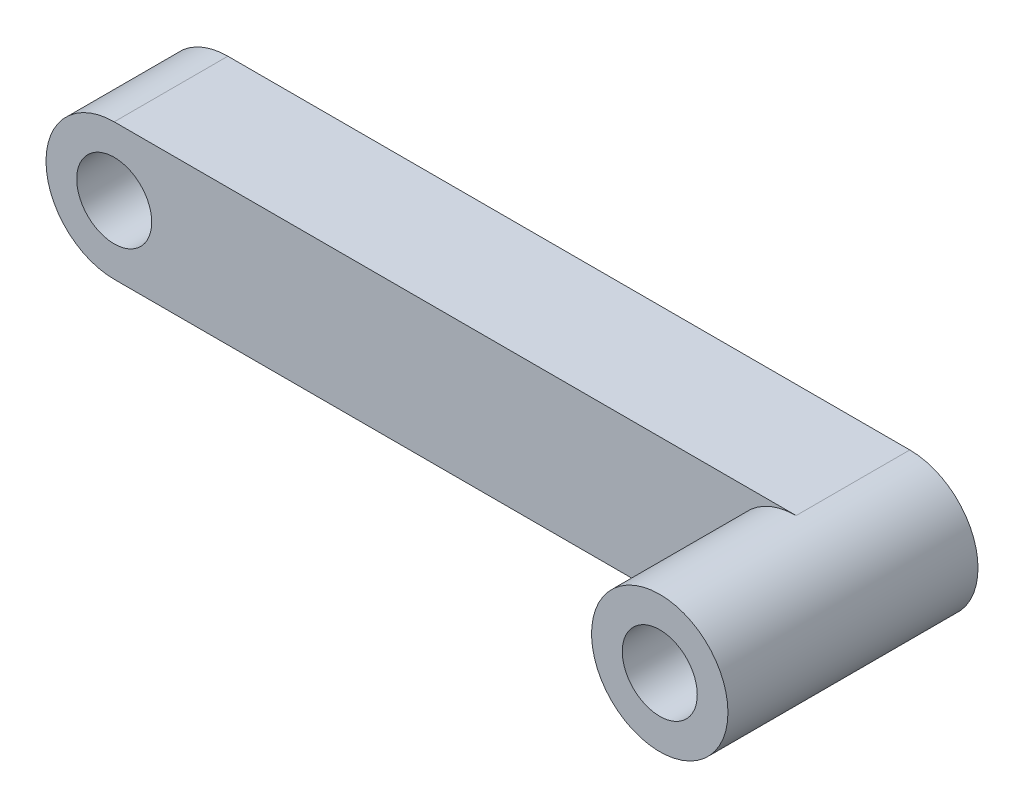
ISO-10303-21;
HEADER;
FILE_DESCRIPTION(('STEP AP214'),'2;1');
FILE_NAME('part.step','',(''),(''),'','','');
FILE_SCHEMA(('AUTOMOTIVE_DESIGN { 1 0 10303 214 1 1 1 1 }'));
ENDSEC;
DATA;
#1=APPLICATION_CONTEXT('core data for automotive mechanical design processes');
#2=APPLICATION_PROTOCOL_DEFINITION('international standard','automotive_design',2000,#1);
#3=PRODUCT_CONTEXT('',#1,'mechanical');
#4=PRODUCT('Part','Part','',(#3));
#5=PRODUCT_RELATED_PRODUCT_CATEGORY('part','',(#4));
#6=PRODUCT_DEFINITION_FORMATION('','',#4);
#7=PRODUCT_DEFINITION_CONTEXT('part definition',#1,'design');
#8=PRODUCT_DEFINITION('design','',#6,#7);
#9=PRODUCT_DEFINITION_SHAPE('','',#8);
#10=(LENGTH_UNIT() NAMED_UNIT(*) SI_UNIT(.MILLI.,.METRE.));
#11=(NAMED_UNIT(*) PLANE_ANGLE_UNIT() SI_UNIT($,.RADIAN.));
#12=(NAMED_UNIT(*) SI_UNIT($,.STERADIAN.) SOLID_ANGLE_UNIT());
#13=UNCERTAINTY_MEASURE_WITH_UNIT(LENGTH_MEASURE(1.E-05),#10,'distance_accuracy_value','');
#14=(GEOMETRIC_REPRESENTATION_CONTEXT(3) GLOBAL_UNCERTAINTY_ASSIGNED_CONTEXT((#13)) GLOBAL_UNIT_ASSIGNED_CONTEXT((#10,
#11,#12)) REPRESENTATION_CONTEXT('',''));
#15=CARTESIAN_POINT('',(0.,0.,0.));
#16=DIRECTION('',(0.,0.,1.));
#17=DIRECTION('',(1.,0.,0.));
#18=AXIS2_PLACEMENT_3D('',#15,#16,#17);
#19=CARTESIAN_POINT('',(0.,-3.,5.));
#20=DIRECTION('',(0.,1.,0.));
#21=DIRECTION('',(0.,0.,1.));
#22=AXIS2_PLACEMENT_3D('',#19,#20,#21);
#23=PLANE('',#22);
#24=DIRECTION('',(1.,0.,0.));
#25=VECTOR('',#24,1.);
#26=CARTESIAN_POINT('',(0.,-3.,0.));
#27=LINE('',#26,#25);
#28=CARTESIAN_POINT('',(-30.,-3.,0.));
#29=VERTEX_POINT('',#28);
#30=CARTESIAN_POINT('',(0.,-3.,0.));
#31=VERTEX_POINT('',#30);
#32=EDGE_CURVE('E104',#29,#31,#27,.T.);
#33=ORIENTED_EDGE('',*,*,#32,.T.);
#34=DIRECTION('',(0.,0.,-1.));
#35=VECTOR('',#34,1.);
#36=CARTESIAN_POINT('',(0.,-3.,5.));
#37=LINE('',#36,#35);
#38=CARTESIAN_POINT('',(0.,-3.,5.));
#39=VERTEX_POINT('',#38);
#40=EDGE_CURVE('E11',#39,#31,#37,.T.);
#41=ORIENTED_EDGE('',*,*,#40,.F.);
#42=DIRECTION('',(1.,0.,0.));
#43=VECTOR('',#42,1.);
#44=CARTESIAN_POINT('',(0.,-3.,5.));
#45=LINE('',#44,#43);
#46=CARTESIAN_POINT('',(-30.,-3.,5.));
#47=VERTEX_POINT('',#46);
#48=EDGE_CURVE('E80',#47,#39,#45,.T.);
#49=ORIENTED_EDGE('',*,*,#48,.F.);
#50=DIRECTION('',(0.,0.,-1.));
#51=VECTOR('',#50,1.);
#52=CARTESIAN_POINT('',(-30.,-3.,5.));
#53=LINE('',#52,#51);
#54=EDGE_CURVE('E115',#47,#29,#53,.T.);
#55=ORIENTED_EDGE('',*,*,#54,.T.);
#56=EDGE_LOOP('',(#33,#41,#49,#55));
#57=FACE_BOUND('',#56,.T.);
#58=ADVANCED_FACE('F41',(#57),#23,.F.);
#59=CARTESIAN_POINT('',(0.,0.,5.));
#60=DIRECTION('',(0.,0.,-1.));
#61=DIRECTION('',(-1.,0.,0.));
#62=AXIS2_PLACEMENT_3D('',#59,#60,#61);
#63=CYLINDRICAL_SURFACE('',#62,3.);
#64=CARTESIAN_POINT('',(0.,0.,0.));
#65=DIRECTION('',(0.,0.,1.));
#66=DIRECTION('',(1.,0.,0.));
#67=AXIS2_PLACEMENT_3D('',#64,#65,#66);
#68=CIRCLE('',#67,3.);
#69=CARTESIAN_POINT('',(0.,3.,0.));
#70=VERTEX_POINT('',#69);
#71=EDGE_CURVE('E96',#31,#70,#68,.T.);
#72=ORIENTED_EDGE('',*,*,#71,.T.);
#73=DIRECTION('',(0.,0.,-1.));
#74=VECTOR('',#73,1.);
#75=CARTESIAN_POINT('',(0.,3.,5.));
#76=LINE('',#75,#74);
#77=CARTESIAN_POINT('',(0.,3.,5.));
#78=VERTEX_POINT('',#77);
#79=EDGE_CURVE('E49',#78,#70,#76,.T.);
#80=ORIENTED_EDGE('',*,*,#79,.F.);
#81=CARTESIAN_POINT('',(0.,0.,5.));
#82=DIRECTION('',(0.,0.,1.));
#83=DIRECTION('',(1.,0.,0.));
#84=AXIS2_PLACEMENT_3D('',#81,#82,#83);
#85=CIRCLE('',#84,3.);
#86=EDGE_CURVE('E95',#78,#39,#85,.T.);
#87=ORIENTED_EDGE('',*,*,#86,.T.);
#88=ORIENTED_EDGE('',*,*,#40,.T.);
#89=EDGE_LOOP('',(#72,#80,#87,#88));
#90=FACE_BOUND('',#89,.T.);
#91=CARTESIAN_POINT('',(0.,0.,11.));
#92=DIRECTION('',(0.,0.,1.));
#93=DIRECTION('',(1.,0.,0.));
#94=AXIS2_PLACEMENT_3D('',#91,#92,#93);
#95=CIRCLE('',#94,3.);
#96=CARTESIAN_POINT('',(3.,0.,11.));
#97=VERTEX_POINT('',#96);
#98=EDGE_CURVE('E100',#97,#97,#95,.T.);
#99=ORIENTED_EDGE('',*,*,#98,.F.);
#100=EDGE_LOOP('',(#99));
#101=FACE_BOUND('',#100,.T.);
#102=ADVANCED_FACE('F93',(#90,#101),#63,.T.);
#103=CARTESIAN_POINT('',(0.,3.,5.));
#104=DIRECTION('',(0.,1.,0.));
#105=DIRECTION('',(0.,0.,1.));
#106=AXIS2_PLACEMENT_3D('',#103,#104,#105);
#107=PLANE('',#106);
#108=DIRECTION('',(1.,0.,0.));
#109=VECTOR('',#108,1.);
#110=CARTESIAN_POINT('',(0.,3.,0.));
#111=LINE('',#110,#109);
#112=CARTESIAN_POINT('',(-30.,3.,0.));
#113=VERTEX_POINT('',#112);
#114=EDGE_CURVE('E119',#113,#70,#111,.T.);
#115=ORIENTED_EDGE('',*,*,#114,.F.);
#116=DIRECTION('',(0.,0.,-1.));
#117=VECTOR('',#116,1.);
#118=CARTESIAN_POINT('',(-30.,3.,5.));
#119=LINE('',#118,#117);
#120=CARTESIAN_POINT('',(-30.,3.,5.));
#121=VERTEX_POINT('',#120);
#122=EDGE_CURVE('E74',#121,#113,#119,.T.);
#123=ORIENTED_EDGE('',*,*,#122,.F.);
#124=DIRECTION('',(1.,0.,0.));
#125=VECTOR('',#124,1.);
#126=CARTESIAN_POINT('',(0.,3.,5.));
#127=LINE('',#126,#125);
#128=EDGE_CURVE('E85',#121,#78,#127,.T.);
#129=ORIENTED_EDGE('',*,*,#128,.T.);
#130=ORIENTED_EDGE('',*,*,#79,.T.);
#131=EDGE_LOOP('',(#115,#123,#129,#130));
#132=FACE_BOUND('',#131,.T.);
#133=ADVANCED_FACE('F88',(#132),#107,.T.);
#134=CARTESIAN_POINT('',(0.,0.,5.));
#135=DIRECTION('',(0.,0.,-1.));
#136=DIRECTION('',(-1.,0.,0.));
#137=AXIS2_PLACEMENT_3D('',#134,#135,#136);
#138=CYLINDRICAL_SURFACE('',#137,1.65);
#139=CARTESIAN_POINT('',(0.,0.,0.));
#140=DIRECTION('',(0.,0.,1.));
#141=DIRECTION('',(1.,0.,0.));
#142=AXIS2_PLACEMENT_3D('',#139,#140,#141);
#143=CIRCLE('',#142,1.65);
#144=CARTESIAN_POINT('',(1.65,0.,0.));
#145=VERTEX_POINT('',#144);
#146=EDGE_CURVE('E122',#145,#145,#143,.T.);
#147=ORIENTED_EDGE('',*,*,#146,.F.);
#148=EDGE_LOOP('',(#147));
#149=FACE_BOUND('',#148,.T.);
#150=CARTESIAN_POINT('',(0.,0.,11.));
#151=DIRECTION('',(0.,0.,1.));
#152=DIRECTION('',(1.,0.,0.));
#153=AXIS2_PLACEMENT_3D('',#150,#151,#152);
#154=CIRCLE('',#153,1.65);
#155=CARTESIAN_POINT('',(1.65,0.,11.));
#156=VERTEX_POINT('',#155);
#157=EDGE_CURVE('E101',#156,#156,#154,.T.);
#158=ORIENTED_EDGE('',*,*,#157,.T.);
#159=EDGE_LOOP('',(#158));
#160=FACE_BOUND('',#159,.T.);
#161=ADVANCED_FACE('F150',(#149,#160),#138,.F.);
#162=CARTESIAN_POINT('',(-30.,0.,5.));
#163=DIRECTION('',(0.,0.,-1.));
#164=DIRECTION('',(-1.,0.,0.));
#165=AXIS2_PLACEMENT_3D('',#162,#163,#164);
#166=CYLINDRICAL_SURFACE('',#165,3.);
#167=CARTESIAN_POINT('',(-30.,0.,0.));
#168=DIRECTION('',(0.,0.,1.));
#169=DIRECTION('',(1.,0.,0.));
#170=AXIS2_PLACEMENT_3D('',#167,#168,#169);
#171=CIRCLE('',#170,3.);
#172=EDGE_CURVE('E76',#113,#29,#171,.T.);
#173=ORIENTED_EDGE('',*,*,#172,.T.);
#174=ORIENTED_EDGE('',*,*,#54,.F.);
#175=CARTESIAN_POINT('',(-30.,0.,5.));
#176=DIRECTION('',(0.,0.,1.));
#177=DIRECTION('',(1.,0.,0.));
#178=AXIS2_PLACEMENT_3D('',#175,#176,#177);
#179=CIRCLE('',#178,3.);
#180=EDGE_CURVE('E57',#121,#47,#179,.T.);
#181=ORIENTED_EDGE('',*,*,#180,.F.);
#182=ORIENTED_EDGE('',*,*,#122,.T.);
#183=EDGE_LOOP('',(#173,#174,#181,#182));
#184=FACE_BOUND('',#183,.T.);
#185=ADVANCED_FACE('F142',(#184),#166,.T.);
#186=CARTESIAN_POINT('',(-30.,0.,5.));
#187=DIRECTION('',(0.,0.,-1.));
#188=DIRECTION('',(-1.,0.,0.));
#189=AXIS2_PLACEMENT_3D('',#186,#187,#188);
#190=CYLINDRICAL_SURFACE('',#189,1.65);
#191=CARTESIAN_POINT('',(-30.,0.,5.));
#192=DIRECTION('',(0.,0.,1.));
#193=DIRECTION('',(1.,0.,0.));
#194=AXIS2_PLACEMENT_3D('',#191,#192,#193);
#195=CIRCLE('',#194,1.65);
#196=CARTESIAN_POINT('',(-28.35,0.,5.));
#197=VERTEX_POINT('',#196);
#198=EDGE_CURVE('E112',#197,#197,#195,.T.);
#199=ORIENTED_EDGE('',*,*,#198,.T.);
#200=EDGE_LOOP('',(#199));
#201=FACE_BOUND('',#200,.T.);
#202=CARTESIAN_POINT('',(-30.,0.,0.));
#203=DIRECTION('',(0.,0.,1.));
#204=DIRECTION('',(1.,0.,0.));
#205=AXIS2_PLACEMENT_3D('',#202,#203,#204);
#206=CIRCLE('',#205,1.65);
#207=CARTESIAN_POINT('',(-28.35,0.,0.));
#208=VERTEX_POINT('',#207);
#209=EDGE_CURVE('E109',#208,#208,#206,.T.);
#210=ORIENTED_EDGE('',*,*,#209,.F.);
#211=EDGE_LOOP('',(#210));
#212=FACE_BOUND('',#211,.T.);
#213=ADVANCED_FACE('F140',(#201,#212),#190,.F.);
#214=CARTESIAN_POINT('',(0.,0.,5.));
#215=DIRECTION('',(0.,0.,1.));
#216=DIRECTION('',(1.,0.,0.));
#217=AXIS2_PLACEMENT_3D('',#214,#215,#216);
#218=PLANE('',#217);
#219=ORIENTED_EDGE('',*,*,#86,.F.);
#220=ORIENTED_EDGE('',*,*,#128,.F.);
#221=ORIENTED_EDGE('',*,*,#180,.T.);
#222=ORIENTED_EDGE('',*,*,#48,.T.);
#223=EDGE_LOOP('',(#219,#220,#221,#222));
#224=FACE_BOUND('',#223,.T.);
#225=ORIENTED_EDGE('',*,*,#198,.F.);
#226=EDGE_LOOP('',(#225));
#227=FACE_BOUND('',#226,.T.);
#228=ADVANCED_FACE('F98',(#224,#227),#218,.T.);
#229=CARTESIAN_POINT('',(0.,0.,0.));
#230=DIRECTION('',(0.,0.,1.));
#231=DIRECTION('',(1.,0.,0.));
#232=AXIS2_PLACEMENT_3D('',#229,#230,#231);
#233=PLANE('',#232);
#234=ORIENTED_EDGE('',*,*,#32,.F.);
#235=ORIENTED_EDGE('',*,*,#172,.F.);
#236=ORIENTED_EDGE('',*,*,#114,.T.);
#237=ORIENTED_EDGE('',*,*,#71,.F.);
#238=EDGE_LOOP('',(#234,#235,#236,#237));
#239=FACE_BOUND('',#238,.T.);
#240=ORIENTED_EDGE('',*,*,#146,.T.);
#241=EDGE_LOOP('',(#240));
#242=FACE_BOUND('',#241,.T.);
#243=ORIENTED_EDGE('',*,*,#209,.T.);
#244=EDGE_LOOP('',(#243));
#245=FACE_BOUND('',#244,.T.);
#246=ADVANCED_FACE('F131',(#239,#242,#245),#233,.F.);
#247=CARTESIAN_POINT('',(0.,0.,11.));
#248=DIRECTION('',(0.,0.,1.));
#249=DIRECTION('',(1.,0.,0.));
#250=AXIS2_PLACEMENT_3D('',#247,#248,#249);
#251=PLANE('',#250);
#252=ORIENTED_EDGE('',*,*,#98,.T.);
#253=EDGE_LOOP('',(#252));
#254=FACE_BOUND('',#253,.T.);
#255=ORIENTED_EDGE('',*,*,#157,.F.);
#256=EDGE_LOOP('',(#255));
#257=FACE_BOUND('',#256,.T.);
#258=ADVANCED_FACE('F134',(#254,#257),#251,.T.);
#259=CLOSED_SHELL('',(#58,#102,#133,#161,#185,#213,#228,#246,#258));
#260=MANIFOLD_SOLID_BREP('B2',#259);
#261=ADVANCED_BREP_SHAPE_REPRESENTATION('',(#18,#260),#14);
#262=SHAPE_DEFINITION_REPRESENTATION(#9,#261);
ENDSEC;
END-ISO-10303-21;
